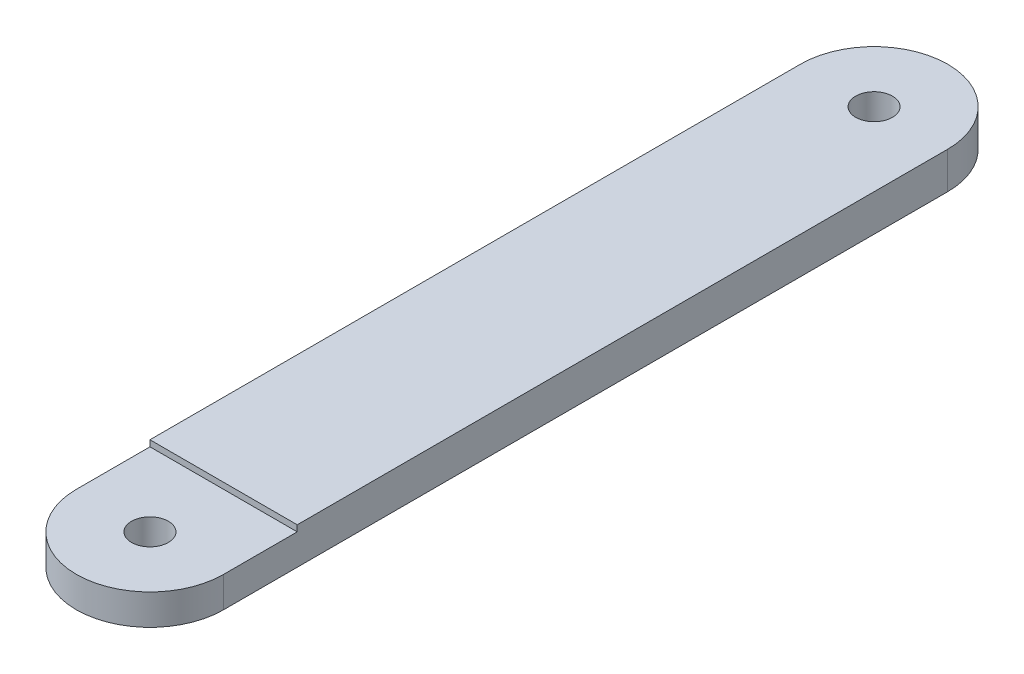
ISO-10303-21;
HEADER;
FILE_DESCRIPTION(('STEP AP214'),'2;1');
FILE_NAME('part.step','',(''),(''),'','','');
FILE_SCHEMA(('AUTOMOTIVE_DESIGN { 1 0 10303 214 1 1 1 1 }'));
ENDSEC;
DATA;
#1=APPLICATION_CONTEXT('core data for automotive mechanical design processes');
#2=APPLICATION_PROTOCOL_DEFINITION('international standard','automotive_design',2000,#1);
#3=PRODUCT_CONTEXT('',#1,'mechanical');
#4=PRODUCT('Part','Part','',(#3));
#5=PRODUCT_RELATED_PRODUCT_CATEGORY('part','',(#4));
#6=PRODUCT_DEFINITION_FORMATION('','',#4);
#7=PRODUCT_DEFINITION_CONTEXT('part definition',#1,'design');
#8=PRODUCT_DEFINITION('design','',#6,#7);
#9=PRODUCT_DEFINITION_SHAPE('','',#8);
#10=(LENGTH_UNIT() NAMED_UNIT(*) SI_UNIT(.MILLI.,.METRE.));
#11=(NAMED_UNIT(*) PLANE_ANGLE_UNIT() SI_UNIT($,.RADIAN.));
#12=(NAMED_UNIT(*) SI_UNIT($,.STERADIAN.) SOLID_ANGLE_UNIT());
#13=UNCERTAINTY_MEASURE_WITH_UNIT(LENGTH_MEASURE(1.E-05),#10,'distance_accuracy_value','');
#14=(GEOMETRIC_REPRESENTATION_CONTEXT(3) GLOBAL_UNCERTAINTY_ASSIGNED_CONTEXT((#13)) GLOBAL_UNIT_ASSIGNED_CONTEXT((#10,
#11,#12)) REPRESENTATION_CONTEXT('',''));
#15=CARTESIAN_POINT('',(0.,0.,0.));
#16=DIRECTION('',(0.,0.,1.));
#17=DIRECTION('',(1.,0.,0.));
#18=AXIS2_PLACEMENT_3D('',#15,#16,#17);
#19=CARTESIAN_POINT('',(6.,0.,-6.00000008940697));
#20=DIRECTION('',(0.,1.,0.));
#21=DIRECTION('',(-1.,0.,0.));
#22=AXIS2_PLACEMENT_3D('',#19,#20,#21);
#23=CYLINDRICAL_SURFACE('',#22,6.);
#24=DIRECTION('',(0.,1.,0.));
#25=VECTOR('',#24,1.);
#26=CARTESIAN_POINT('',(12.,0.,-6.00000008940697));
#27=LINE('',#26,#25);
#28=CARTESIAN_POINT('',(12.,0.,-6.00000008940697));
#29=VERTEX_POINT('',#28);
#30=CARTESIAN_POINT('',(12.,2.5,-6.00000008940697));
#31=VERTEX_POINT('',#30);
#32=EDGE_CURVE('E60',#29,#31,#27,.T.);
#33=ORIENTED_EDGE('',*,*,#32,.T.);
#34=CARTESIAN_POINT('',(6.,2.5,-6.00000008940697));
#35=DIRECTION('',(0.,1.,0.));
#36=DIRECTION('',(0.,0.,1.));
#37=AXIS2_PLACEMENT_3D('',#34,#35,#36);
#38=CIRCLE('',#37,6.);
#39=CARTESIAN_POINT('',(0.,2.5,-6.00000008940697));
#40=VERTEX_POINT('',#39);
#41=EDGE_CURVE('E124',#40,#31,#38,.T.);
#42=ORIENTED_EDGE('',*,*,#41,.F.);
#43=DIRECTION('',(0.,1.,0.));
#44=VECTOR('',#43,1.);
#45=CARTESIAN_POINT('',(0.,0.,-6.00000008940697));
#46=LINE('',#45,#44);
#47=CARTESIAN_POINT('',(0.,0.,-6.00000008940697));
#48=VERTEX_POINT('',#47);
#49=EDGE_CURVE('E157',#48,#40,#46,.T.);
#50=ORIENTED_EDGE('',*,*,#49,.F.);
#51=CARTESIAN_POINT('',(6.,0.,-6.00000008940697));
#52=DIRECTION('',(0.,1.,0.));
#53=DIRECTION('',(-1.,0.,0.));
#54=AXIS2_PLACEMENT_3D('',#51,#52,#53);
#55=CIRCLE('',#54,6.);
#56=EDGE_CURVE('E11',#48,#29,#55,.T.);
#57=ORIENTED_EDGE('',*,*,#56,.T.);
#58=EDGE_LOOP('',(#33,#42,#50,#57));
#59=FACE_BOUND('',#58,.T.);
#60=ADVANCED_FACE('F50',(#59),#23,.T.);
#61=CARTESIAN_POINT('',(6.,0.,-6.00000008940697));
#62=DIRECTION('',(0.,1.,0.));
#63=DIRECTION('',(1.,0.,0.));
#64=AXIS2_PLACEMENT_3D('',#61,#62,#63);
#65=CYLINDRICAL_SURFACE('',#64,1.5);
#66=CARTESIAN_POINT('',(6.,2.5,-6.00000008940697));
#67=DIRECTION('',(0.,1.,0.));
#68=DIRECTION('',(0.,0.,1.));
#69=AXIS2_PLACEMENT_3D('',#66,#67,#68);
#70=CIRCLE('',#69,1.5);
#71=CARTESIAN_POINT('',(4.5,2.5,-6.00000008940697));
#72=VERTEX_POINT('',#71);
#73=EDGE_CURVE('E54',#72,#72,#70,.F.);
#74=ORIENTED_EDGE('',*,*,#73,.F.);
#75=DIRECTION('',(0.,-1.,0.));
#76=VECTOR('',#75,1.);
#77=CARTESIAN_POINT('',(4.5,0.,-6.00000008940697));
#78=LINE('',#77,#76);
#79=CARTESIAN_POINT('',(4.5,0.,-6.00000008940697));
#80=VERTEX_POINT('',#79);
#81=EDGE_CURVE('E154',#72,#80,#78,.T.);
#82=ORIENTED_EDGE('',*,*,#81,.T.);
#83=CARTESIAN_POINT('',(6.,0.,-6.00000008940697));
#84=DIRECTION('',(0.,-1.,0.));
#85=DIRECTION('',(1.,0.,0.));
#86=AXIS2_PLACEMENT_3D('',#83,#84,#85);
#87=CIRCLE('',#86,1.5);
#88=EDGE_CURVE('E155',#80,#80,#87,.T.);
#89=ORIENTED_EDGE('',*,*,#88,.T.);
#90=ORIENTED_EDGE('',*,*,#81,.F.);
#91=EDGE_LOOP('',(#74,#82,#89,#90));
#92=FACE_BOUND('',#91,.T.);
#93=ADVANCED_FACE('F226',(#92),#65,.F.);
#94=CARTESIAN_POINT('',(6.,0.,-28.0000004172325));
#95=DIRECTION('',(0.,1.,0.));
#96=DIRECTION('',(1.,0.,0.));
#97=AXIS2_PLACEMENT_3D('',#94,#95,#96);
#98=PLANE('',#97);
#99=ORIENTED_EDGE('',*,*,#88,.F.);
#100=EDGE_LOOP('',(#99));
#101=FACE_BOUND('',#100,.T.);
#102=DIRECTION('',(0.,0.,-1.));
#103=VECTOR('',#102,1.);
#104=CARTESIAN_POINT('',(0.,0.,-6.00000008940697));
#105=LINE('',#104,#103);
#106=CARTESIAN_POINT('',(0.,0.,-65.0000007450581));
#107=VERTEX_POINT('',#106);
#108=EDGE_CURVE('E160',#48,#107,#105,.T.);
#109=ORIENTED_EDGE('',*,*,#108,.T.);
#110=CARTESIAN_POINT('',(6.,0.,-65.0000007450581));
#111=DIRECTION('',(0.,1.,0.));
#112=DIRECTION('',(1.,0.,0.));
#113=AXIS2_PLACEMENT_3D('',#110,#111,#112);
#114=CIRCLE('',#113,6.);
#115=CARTESIAN_POINT('',(12.,0.,-65.0000007450581));
#116=VERTEX_POINT('',#115);
#117=EDGE_CURVE('E179',#116,#107,#114,.T.);
#118=ORIENTED_EDGE('',*,*,#117,.F.);
#119=DIRECTION('',(0.,0.,1.));
#120=VECTOR('',#119,1.);
#121=CARTESIAN_POINT('',(12.,0.,-50.0000007450581));
#122=LINE('',#121,#120);
#123=EDGE_CURVE('E150',#116,#29,#122,.T.);
#124=ORIENTED_EDGE('',*,*,#123,.T.);
#125=ORIENTED_EDGE('',*,*,#56,.F.);
#126=EDGE_LOOP('',(#109,#118,#124,#125));
#127=FACE_BOUND('',#126,.T.);
#128=CARTESIAN_POINT('',(6.,0.,-65.0000007450581));
#129=DIRECTION('',(0.,-1.,0.));
#130=DIRECTION('',(1.,0.,0.));
#131=AXIS2_PLACEMENT_3D('',#128,#129,#130);
#132=CIRCLE('',#131,1.5);
#133=CARTESIAN_POINT('',(4.5,0.,-65.0000007450581));
#134=VERTEX_POINT('',#133);
#135=EDGE_CURVE('E195',#134,#134,#132,.T.);
#136=ORIENTED_EDGE('',*,*,#135,.F.);
#137=EDGE_LOOP('',(#136));
#138=FACE_BOUND('',#137,.T.);
#139=ADVANCED_FACE('F52',(#101,#127,#138),#98,.F.);
#140=CARTESIAN_POINT('',(6.,3.,-28.0000004172325));
#141=DIRECTION('',(0.,1.,0.));
#142=DIRECTION('',(1.,0.,0.));
#143=AXIS2_PLACEMENT_3D('',#140,#141,#142);
#144=PLANE('',#143);
#145=DIRECTION('',(-1.,0.,0.));
#146=VECTOR('',#145,1.);
#147=CARTESIAN_POINT('',(0.,3.,-12.000000089407));
#148=LINE('',#147,#146);
#149=CARTESIAN_POINT('',(12.,3.,-12.000000089407));
#150=VERTEX_POINT('',#149);
#151=CARTESIAN_POINT('',(0.,3.,-12.000000089407));
#152=VERTEX_POINT('',#151);
#153=EDGE_CURVE('E136',#150,#152,#148,.T.);
#154=ORIENTED_EDGE('',*,*,#153,.F.);
#155=DIRECTION('',(0.,0.,-1.));
#156=VECTOR('',#155,1.);
#157=CARTESIAN_POINT('',(12.,3.,-50.0000007450581));
#158=LINE('',#157,#156);
#159=CARTESIAN_POINT('',(12.,3.,-65.0000007450581));
#160=VERTEX_POINT('',#159);
#161=EDGE_CURVE('E146',#150,#160,#158,.T.);
#162=ORIENTED_EDGE('',*,*,#161,.T.);
#163=CARTESIAN_POINT('',(6.,3.,-65.0000007450581));
#164=DIRECTION('',(0.,1.,0.));
#165=DIRECTION('',(1.,0.,0.));
#166=AXIS2_PLACEMENT_3D('',#163,#164,#165);
#167=CIRCLE('',#166,6.);
#168=CARTESIAN_POINT('',(0.,3.,-65.0000007450581));
#169=VERTEX_POINT('',#168);
#170=EDGE_CURVE('E189',#160,#169,#167,.T.);
#171=ORIENTED_EDGE('',*,*,#170,.T.);
#172=DIRECTION('',(0.,0.,1.));
#173=VECTOR('',#172,1.);
#174=CARTESIAN_POINT('',(0.,3.,-6.00000008940697));
#175=LINE('',#174,#173);
#176=EDGE_CURVE('E159',#169,#152,#175,.T.);
#177=ORIENTED_EDGE('',*,*,#176,.T.);
#178=EDGE_LOOP('',(#154,#162,#171,#177));
#179=FACE_BOUND('',#178,.T.);
#180=CARTESIAN_POINT('',(6.,3.,-65.0000007450581));
#181=DIRECTION('',(0.,-1.,0.));
#182=DIRECTION('',(1.,0.,0.));
#183=AXIS2_PLACEMENT_3D('',#180,#181,#182);
#184=CIRCLE('',#183,1.5);
#185=CARTESIAN_POINT('',(4.5,3.,-65.0000007450581));
#186=VERTEX_POINT('',#185);
#187=EDGE_CURVE('E156',#186,#186,#184,.T.);
#188=ORIENTED_EDGE('',*,*,#187,.T.);
#189=EDGE_LOOP('',(#188));
#190=FACE_BOUND('',#189,.T.);
#191=ADVANCED_FACE('F217',(#179,#190),#144,.T.);
#192=CARTESIAN_POINT('',(12.,0.,-6.00000008940697));
#193=DIRECTION('',(1.,0.,0.));
#194=DIRECTION('',(0.,1.,0.));
#195=AXIS2_PLACEMENT_3D('',#192,#193,#194);
#196=PLANE('',#195);
#197=DIRECTION('',(0.,1.,0.));
#198=VECTOR('',#197,1.);
#199=CARTESIAN_POINT('',(12.,2.5,-12.000000089407));
#200=LINE('',#199,#198);
#201=CARTESIAN_POINT('',(12.,2.5,-12.000000089407));
#202=VERTEX_POINT('',#201);
#203=EDGE_CURVE('E142',#202,#150,#200,.T.);
#204=ORIENTED_EDGE('',*,*,#203,.F.);
#205=DIRECTION('',(0.,0.,-1.));
#206=VECTOR('',#205,1.);
#207=CARTESIAN_POINT('',(12.,2.5,-6.00000008940697));
#208=LINE('',#207,#206);
#209=EDGE_CURVE('E127',#31,#202,#208,.T.);
#210=ORIENTED_EDGE('',*,*,#209,.F.);
#211=ORIENTED_EDGE('',*,*,#32,.F.);
#212=ORIENTED_EDGE('',*,*,#123,.F.);
#213=DIRECTION('',(0.,1.,0.));
#214=VECTOR('',#213,1.);
#215=CARTESIAN_POINT('',(12.,0.,-65.0000007450581));
#216=LINE('',#215,#214);
#217=EDGE_CURVE('E182',#116,#160,#216,.T.);
#218=ORIENTED_EDGE('',*,*,#217,.T.);
#219=ORIENTED_EDGE('',*,*,#161,.F.);
#220=EDGE_LOOP('',(#204,#210,#211,#212,#218,#219));
#221=FACE_BOUND('',#220,.T.);
#222=ADVANCED_FACE('F140',(#221),#196,.T.);
#223=CARTESIAN_POINT('',(0.,0.,-50.0000007450581));
#224=DIRECTION('',(-1.,0.,0.));
#225=DIRECTION('',(0.,0.,1.));
#226=AXIS2_PLACEMENT_3D('',#223,#224,#225);
#227=PLANE('',#226);
#228=DIRECTION('',(0.,1.,0.));
#229=VECTOR('',#228,1.);
#230=CARTESIAN_POINT('',(0.,2.5,-12.000000089407));
#231=LINE('',#230,#229);
#232=CARTESIAN_POINT('',(0.,2.5,-12.000000089407));
#233=VERTEX_POINT('',#232);
#234=EDGE_CURVE('E192',#233,#152,#231,.T.);
#235=ORIENTED_EDGE('',*,*,#234,.T.);
#236=ORIENTED_EDGE('',*,*,#176,.F.);
#237=DIRECTION('',(0.,1.,0.));
#238=VECTOR('',#237,1.);
#239=CARTESIAN_POINT('',(0.,0.,-65.0000007450581));
#240=LINE('',#239,#238);
#241=EDGE_CURVE('E176',#107,#169,#240,.T.);
#242=ORIENTED_EDGE('',*,*,#241,.F.);
#243=ORIENTED_EDGE('',*,*,#108,.F.);
#244=ORIENTED_EDGE('',*,*,#49,.T.);
#245=DIRECTION('',(0.,0.,1.));
#246=VECTOR('',#245,1.);
#247=CARTESIAN_POINT('',(0.,2.5,-12.000000089407));
#248=LINE('',#247,#246);
#249=EDGE_CURVE('E130',#233,#40,#248,.T.);
#250=ORIENTED_EDGE('',*,*,#249,.F.);
#251=EDGE_LOOP('',(#235,#236,#242,#243,#244,#250));
#252=FACE_BOUND('',#251,.T.);
#253=ADVANCED_FACE('F216',(#252),#227,.T.);
#254=CARTESIAN_POINT('',(6.,0.,-65.0000007450581));
#255=DIRECTION('',(0.,1.,0.));
#256=DIRECTION('',(1.,0.,0.));
#257=AXIS2_PLACEMENT_3D('',#254,#255,#256);
#258=CYLINDRICAL_SURFACE('',#257,1.5);
#259=ORIENTED_EDGE('',*,*,#187,.F.);
#260=DIRECTION('',(0.,-1.,0.));
#261=VECTOR('',#260,1.);
#262=CARTESIAN_POINT('',(4.5,0.,-65.0000007450581));
#263=LINE('',#262,#261);
#264=EDGE_CURVE('E197',#186,#134,#263,.T.);
#265=ORIENTED_EDGE('',*,*,#264,.T.);
#266=ORIENTED_EDGE('',*,*,#135,.T.);
#267=ORIENTED_EDGE('',*,*,#264,.F.);
#268=EDGE_LOOP('',(#259,#265,#266,#267));
#269=FACE_BOUND('',#268,.T.);
#270=ADVANCED_FACE('F223',(#269),#258,.F.);
#271=CARTESIAN_POINT('',(6.,0.,-65.0000007450581));
#272=DIRECTION('',(0.,1.,0.));
#273=DIRECTION('',(1.,0.,0.));
#274=AXIS2_PLACEMENT_3D('',#271,#272,#273);
#275=CYLINDRICAL_SURFACE('',#274,6.);
#276=ORIENTED_EDGE('',*,*,#117,.T.);
#277=ORIENTED_EDGE('',*,*,#241,.T.);
#278=ORIENTED_EDGE('',*,*,#170,.F.);
#279=ORIENTED_EDGE('',*,*,#217,.F.);
#280=EDGE_LOOP('',(#276,#277,#278,#279));
#281=FACE_BOUND('',#280,.T.);
#282=ADVANCED_FACE('F185',(#281),#275,.T.);
#283=CARTESIAN_POINT('',(6.,2.5,-6.00000008940697));
#284=DIRECTION('',(0.,1.,0.));
#285=DIRECTION('',(0.,0.,1.));
#286=AXIS2_PLACEMENT_3D('',#283,#284,#285);
#287=PLANE('',#286);
#288=ORIENTED_EDGE('',*,*,#41,.T.);
#289=ORIENTED_EDGE('',*,*,#209,.T.);
#290=DIRECTION('',(-1.,0.,0.));
#291=VECTOR('',#290,1.);
#292=CARTESIAN_POINT('',(0.,2.5,-12.000000089407));
#293=LINE('',#292,#291);
#294=EDGE_CURVE('E71',#202,#233,#293,.T.);
#295=ORIENTED_EDGE('',*,*,#294,.T.);
#296=ORIENTED_EDGE('',*,*,#249,.T.);
#297=EDGE_LOOP('',(#288,#289,#295,#296));
#298=FACE_BOUND('',#297,.T.);
#299=ORIENTED_EDGE('',*,*,#73,.T.);
#300=EDGE_LOOP('',(#299));
#301=FACE_BOUND('',#300,.T.);
#302=ADVANCED_FACE('F126',(#298,#301),#287,.T.);
#303=CARTESIAN_POINT('',(0.,2.5,-12.000000089407));
#304=DIRECTION('',(0.,0.,-1.));
#305=DIRECTION('',(-1.,0.,0.));
#306=AXIS2_PLACEMENT_3D('',#303,#304,#305);
#307=PLANE('',#306);
#308=ORIENTED_EDGE('',*,*,#153,.T.);
#309=ORIENTED_EDGE('',*,*,#234,.F.);
#310=ORIENTED_EDGE('',*,*,#294,.F.);
#311=ORIENTED_EDGE('',*,*,#203,.T.);
#312=EDGE_LOOP('',(#308,#309,#310,#311));
#313=FACE_BOUND('',#312,.T.);
#314=ADVANCED_FACE('F214',(#313),#307,.F.);
#315=CLOSED_SHELL('',(#60,#93,#139,#191,#222,#253,#270,#282,#302,#314));
#316=MANIFOLD_SOLID_BREP('B2',#315);
#317=ADVANCED_BREP_SHAPE_REPRESENTATION('',(#18,#316),#14);
#318=SHAPE_DEFINITION_REPRESENTATION(#9,#317);
ENDSEC;
END-ISO-10303-21;
